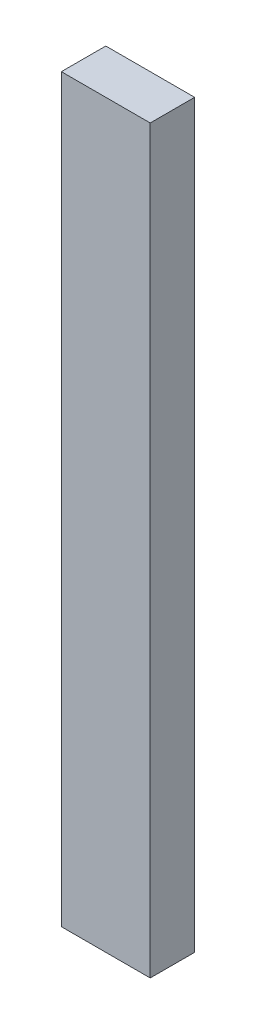
ISO-10303-21;
HEADER;
FILE_DESCRIPTION(('STEP AP214'),'2;1');
FILE_NAME('part.step','',(''),(''),'','','');
FILE_SCHEMA(('AUTOMOTIVE_DESIGN { 1 0 10303 214 1 1 1 1 }'));
ENDSEC;
DATA;
#1=APPLICATION_CONTEXT('core data for automotive mechanical design processes');
#2=APPLICATION_PROTOCOL_DEFINITION('international standard','automotive_design',2000,#1);
#3=PRODUCT_CONTEXT('',#1,'mechanical');
#4=PRODUCT('Part','Part','',(#3));
#5=PRODUCT_RELATED_PRODUCT_CATEGORY('part','',(#4));
#6=PRODUCT_DEFINITION_FORMATION('','',#4);
#7=PRODUCT_DEFINITION_CONTEXT('part definition',#1,'design');
#8=PRODUCT_DEFINITION('design','',#6,#7);
#9=PRODUCT_DEFINITION_SHAPE('','',#8);
#10=(LENGTH_UNIT() NAMED_UNIT(*) SI_UNIT(.MILLI.,.METRE.));
#11=(NAMED_UNIT(*) PLANE_ANGLE_UNIT() SI_UNIT($,.RADIAN.));
#12=(NAMED_UNIT(*) SI_UNIT($,.STERADIAN.) SOLID_ANGLE_UNIT());
#13=UNCERTAINTY_MEASURE_WITH_UNIT(LENGTH_MEASURE(1.E-05),#10,'distance_accuracy_value','');
#14=(GEOMETRIC_REPRESENTATION_CONTEXT(3) GLOBAL_UNCERTAINTY_ASSIGNED_CONTEXT((#13)) GLOBAL_UNIT_ASSIGNED_CONTEXT((#10,
#11,#12)) REPRESENTATION_CONTEXT('',''));
#15=CARTESIAN_POINT('',(0.,0.,0.));
#16=DIRECTION('',(0.,0.,1.));
#17=DIRECTION('',(1.,0.,0.));
#18=AXIS2_PLACEMENT_3D('',#15,#16,#17);
#19=CARTESIAN_POINT('',(6.,-50.,6.));
#20=DIRECTION('',(-1.,0.,0.));
#21=DIRECTION('',(0.,0.,1.));
#22=AXIS2_PLACEMENT_3D('',#19,#20,#21);
#23=PLANE('',#22);
#24=DIRECTION('',(0.,1.,0.));
#25=VECTOR('',#24,1.);
#26=CARTESIAN_POINT('',(6.,-50.,0.));
#27=LINE('',#26,#25);
#28=CARTESIAN_POINT('',(6.,-50.,0.));
#29=VERTEX_POINT('',#28);
#30=CARTESIAN_POINT('',(6.,50.,0.));
#31=VERTEX_POINT('',#30);
#32=EDGE_CURVE('E96',#29,#31,#27,.T.);
#33=ORIENTED_EDGE('',*,*,#32,.T.);
#34=DIRECTION('',(0.,0.,-1.));
#35=VECTOR('',#34,1.);
#36=CARTESIAN_POINT('',(6.,50.,6.));
#37=LINE('',#36,#35);
#38=CARTESIAN_POINT('',(6.,50.,6.));
#39=VERTEX_POINT('',#38);
#40=EDGE_CURVE('E11',#39,#31,#37,.T.);
#41=ORIENTED_EDGE('',*,*,#40,.F.);
#42=DIRECTION('',(0.,1.,0.));
#43=VECTOR('',#42,1.);
#44=CARTESIAN_POINT('',(6.,-50.,6.));
#45=LINE('',#44,#43);
#46=CARTESIAN_POINT('',(6.,-50.,6.));
#47=VERTEX_POINT('',#46);
#48=EDGE_CURVE('E84',#47,#39,#45,.T.);
#49=ORIENTED_EDGE('',*,*,#48,.F.);
#50=DIRECTION('',(0.,0.,-1.));
#51=VECTOR('',#50,1.);
#52=CARTESIAN_POINT('',(6.,-50.,6.));
#53=LINE('',#52,#51);
#54=EDGE_CURVE('E92',#47,#29,#53,.T.);
#55=ORIENTED_EDGE('',*,*,#54,.T.);
#56=EDGE_LOOP('',(#33,#41,#49,#55));
#57=FACE_BOUND('',#56,.T.);
#58=ADVANCED_FACE('F33',(#57),#23,.F.);
#59=CARTESIAN_POINT('',(-6.,50.,6.));
#60=DIRECTION('',(0.,-1.,0.));
#61=DIRECTION('',(0.,0.,-1.));
#62=AXIS2_PLACEMENT_3D('',#59,#60,#61);
#63=PLANE('',#62);
#64=DIRECTION('',(-1.,0.,0.));
#65=VECTOR('',#64,1.);
#66=CARTESIAN_POINT('',(-6.,50.,0.));
#67=LINE('',#66,#65);
#68=CARTESIAN_POINT('',(-6.,50.,0.));
#69=VERTEX_POINT('',#68);
#70=EDGE_CURVE('E88',#31,#69,#67,.T.);
#71=ORIENTED_EDGE('',*,*,#70,.T.);
#72=DIRECTION('',(0.,0.,-1.));
#73=VECTOR('',#72,1.);
#74=CARTESIAN_POINT('',(-6.,50.,6.));
#75=LINE('',#74,#73);
#76=CARTESIAN_POINT('',(-6.,50.,6.));
#77=VERTEX_POINT('',#76);
#78=EDGE_CURVE('E41',#77,#69,#75,.T.);
#79=ORIENTED_EDGE('',*,*,#78,.F.);
#80=DIRECTION('',(-1.,0.,0.));
#81=VECTOR('',#80,1.);
#82=CARTESIAN_POINT('',(-6.,50.,6.));
#83=LINE('',#82,#81);
#84=EDGE_CURVE('E79',#39,#77,#83,.T.);
#85=ORIENTED_EDGE('',*,*,#84,.F.);
#86=ORIENTED_EDGE('',*,*,#40,.T.);
#87=EDGE_LOOP('',(#71,#79,#85,#86));
#88=FACE_BOUND('',#87,.T.);
#89=ADVANCED_FACE('F87',(#88),#63,.F.);
#90=CARTESIAN_POINT('',(-6.,-50.,6.));
#91=DIRECTION('',(1.,0.,0.));
#92=DIRECTION('',(0.,0.,-1.));
#93=AXIS2_PLACEMENT_3D('',#90,#91,#92);
#94=PLANE('',#93);
#95=DIRECTION('',(0.,-1.,0.));
#96=VECTOR('',#95,1.);
#97=CARTESIAN_POINT('',(-6.,-50.,0.));
#98=LINE('',#97,#96);
#99=CARTESIAN_POINT('',(-6.,-50.,0.));
#100=VERTEX_POINT('',#99);
#101=EDGE_CURVE('E66',#69,#100,#98,.T.);
#102=ORIENTED_EDGE('',*,*,#101,.T.);
#103=DIRECTION('',(0.,0.,-1.));
#104=VECTOR('',#103,1.);
#105=CARTESIAN_POINT('',(-6.,-50.,6.));
#106=LINE('',#105,#104);
#107=CARTESIAN_POINT('',(-6.,-50.,6.));
#108=VERTEX_POINT('',#107);
#109=EDGE_CURVE('E89',#108,#100,#106,.T.);
#110=ORIENTED_EDGE('',*,*,#109,.F.);
#111=DIRECTION('',(0.,-1.,0.));
#112=VECTOR('',#111,1.);
#113=CARTESIAN_POINT('',(-6.,-50.,6.));
#114=LINE('',#113,#112);
#115=EDGE_CURVE('E82',#77,#108,#114,.T.);
#116=ORIENTED_EDGE('',*,*,#115,.F.);
#117=ORIENTED_EDGE('',*,*,#78,.T.);
#118=EDGE_LOOP('',(#102,#110,#116,#117));
#119=FACE_BOUND('',#118,.T.);
#120=ADVANCED_FACE('F90',(#119),#94,.F.);
#121=CARTESIAN_POINT('',(-6.,-50.,6.));
#122=DIRECTION('',(0.,1.,0.));
#123=DIRECTION('',(0.,0.,1.));
#124=AXIS2_PLACEMENT_3D('',#121,#122,#123);
#125=PLANE('',#124);
#126=DIRECTION('',(1.,0.,0.));
#127=VECTOR('',#126,1.);
#128=CARTESIAN_POINT('',(-6.,-50.,0.));
#129=LINE('',#128,#127);
#130=EDGE_CURVE('E72',#100,#29,#129,.T.);
#131=ORIENTED_EDGE('',*,*,#130,.T.);
#132=ORIENTED_EDGE('',*,*,#54,.F.);
#133=DIRECTION('',(1.,0.,0.));
#134=VECTOR('',#133,1.);
#135=CARTESIAN_POINT('',(-6.,-50.,6.));
#136=LINE('',#135,#134);
#137=EDGE_CURVE('E49',#108,#47,#136,.T.);
#138=ORIENTED_EDGE('',*,*,#137,.F.);
#139=ORIENTED_EDGE('',*,*,#109,.T.);
#140=EDGE_LOOP('',(#131,#132,#138,#139));
#141=FACE_BOUND('',#140,.T.);
#142=ADVANCED_FACE('F103',(#141),#125,.F.);
#143=CARTESIAN_POINT('',(0.,0.,6.));
#144=DIRECTION('',(0.,0.,-1.));
#145=DIRECTION('',(-1.,0.,0.));
#146=AXIS2_PLACEMENT_3D('',#143,#144,#145);
#147=PLANE('',#146);
#148=ORIENTED_EDGE('',*,*,#48,.T.);
#149=ORIENTED_EDGE('',*,*,#84,.T.);
#150=ORIENTED_EDGE('',*,*,#115,.T.);
#151=ORIENTED_EDGE('',*,*,#137,.T.);
#152=EDGE_LOOP('',(#148,#149,#150,#151));
#153=FACE_BOUND('',#152,.T.);
#154=ADVANCED_FACE('F80',(#153),#147,.F.);
#155=CARTESIAN_POINT('',(0.,0.,0.));
#156=DIRECTION('',(0.,0.,-1.));
#157=DIRECTION('',(-1.,0.,0.));
#158=AXIS2_PLACEMENT_3D('',#155,#156,#157);
#159=PLANE('',#158);
#160=ORIENTED_EDGE('',*,*,#32,.F.);
#161=ORIENTED_EDGE('',*,*,#130,.F.);
#162=ORIENTED_EDGE('',*,*,#101,.F.);
#163=ORIENTED_EDGE('',*,*,#70,.F.);
#164=EDGE_LOOP('',(#160,#161,#162,#163));
#165=FACE_BOUND('',#164,.T.);
#166=ADVANCED_FACE('F106',(#165),#159,.T.);
#167=CLOSED_SHELL('',(#58,#89,#120,#142,#154,#166));
#168=MANIFOLD_SOLID_BREP('B2',#167);
#169=ADVANCED_BREP_SHAPE_REPRESENTATION('',(#18,#168),#14);
#170=SHAPE_DEFINITION_REPRESENTATION(#9,#169);
ENDSEC;
END-ISO-10303-21;
